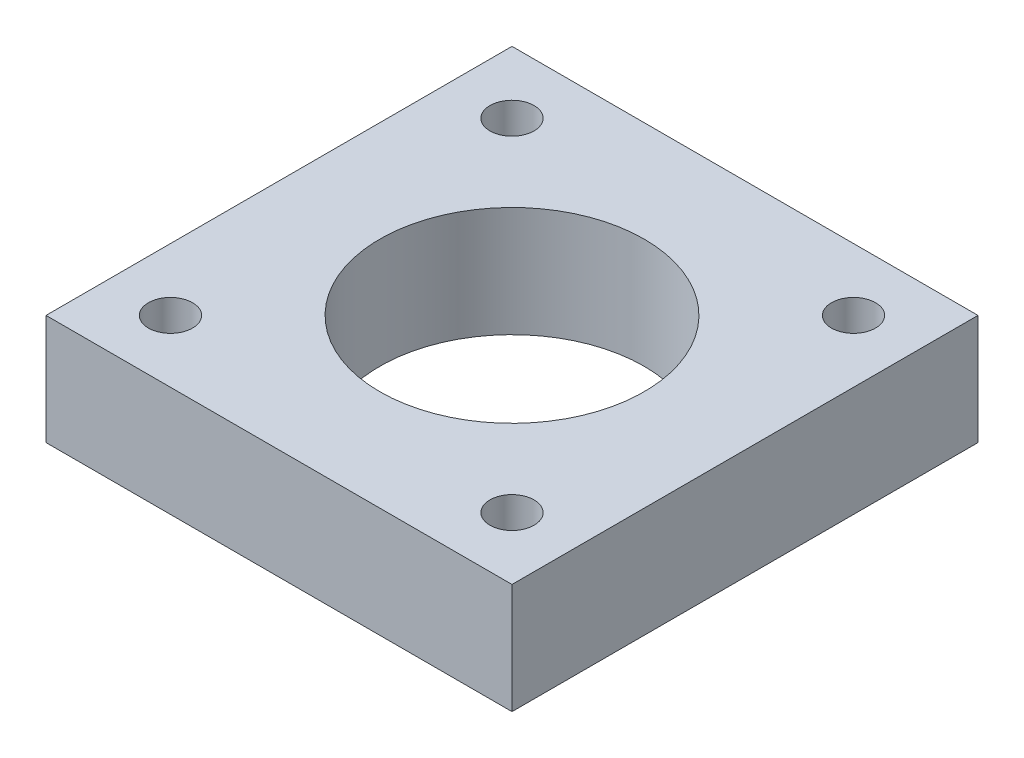
ISO-10303-21;
HEADER;
FILE_DESCRIPTION(('STEP AP214'),'2;1');
FILE_NAME('part.step','',(''),(''),'','','');
FILE_SCHEMA(('AUTOMOTIVE_DESIGN { 1 0 10303 214 1 1 1 1 }'));
ENDSEC;
DATA;
#1=APPLICATION_CONTEXT('core data for automotive mechanical design processes');
#2=APPLICATION_PROTOCOL_DEFINITION('international standard','automotive_design',2000,#1);
#3=PRODUCT_CONTEXT('',#1,'mechanical');
#4=PRODUCT('Part','Part','',(#3));
#5=PRODUCT_RELATED_PRODUCT_CATEGORY('part','',(#4));
#6=PRODUCT_DEFINITION_FORMATION('','',#4);
#7=PRODUCT_DEFINITION_CONTEXT('part definition',#1,'design');
#8=PRODUCT_DEFINITION('design','',#6,#7);
#9=PRODUCT_DEFINITION_SHAPE('','',#8);
#10=(LENGTH_UNIT() NAMED_UNIT(*) SI_UNIT(.MILLI.,.METRE.));
#11=(NAMED_UNIT(*) PLANE_ANGLE_UNIT() SI_UNIT($,.RADIAN.));
#12=(NAMED_UNIT(*) SI_UNIT($,.STERADIAN.) SOLID_ANGLE_UNIT());
#13=UNCERTAINTY_MEASURE_WITH_UNIT(LENGTH_MEASURE(1.E-05),#10,'distance_accuracy_value','');
#14=(GEOMETRIC_REPRESENTATION_CONTEXT(3) GLOBAL_UNCERTAINTY_ASSIGNED_CONTEXT((#13)) GLOBAL_UNIT_ASSIGNED_CONTEXT((#10,
#11,#12)) REPRESENTATION_CONTEXT('',''));
#15=CARTESIAN_POINT('',(0.,0.,0.));
#16=DIRECTION('',(0.,0.,1.));
#17=DIRECTION('',(1.,0.,0.));
#18=AXIS2_PLACEMENT_3D('',#15,#16,#17);
#19=CARTESIAN_POINT('',(0.,10.,0.));
#20=DIRECTION('',(0.,1.,0.));
#21=DIRECTION('',(0.,0.,1.));
#22=AXIS2_PLACEMENT_3D('',#19,#20,#21);
#23=PLANE('',#22);
#24=CARTESIAN_POINT('',(-15.5,10.,15.5));
#25=DIRECTION('',(0.,1.,0.));
#26=DIRECTION('',(0.,0.,1.));
#27=AXIS2_PLACEMENT_3D('',#24,#25,#26);
#28=CIRCLE('',#27,2.);
#29=CARTESIAN_POINT('',(-15.5,10.,17.5));
#30=VERTEX_POINT('',#29);
#31=EDGE_CURVE('E127',#30,#30,#28,.T.);
#32=ORIENTED_EDGE('',*,*,#31,.F.);
#33=EDGE_LOOP('',(#32));
#34=FACE_BOUND('',#33,.T.);
#35=CARTESIAN_POINT('',(15.5,10.,15.5));
#36=DIRECTION('',(0.,1.,0.));
#37=DIRECTION('',(0.,0.,1.));
#38=AXIS2_PLACEMENT_3D('',#35,#36,#37);
#39=CIRCLE('',#38,2.00000000000001);
#40=CARTESIAN_POINT('',(15.5,10.,17.5));
#41=VERTEX_POINT('',#40);
#42=EDGE_CURVE('E115',#41,#41,#39,.T.);
#43=ORIENTED_EDGE('',*,*,#42,.F.);
#44=EDGE_LOOP('',(#43));
#45=FACE_BOUND('',#44,.T.);
#46=DIRECTION('',(0.,0.,-1.));
#47=VECTOR('',#46,1.);
#48=CARTESIAN_POINT('',(21.15,10.,-21.15));
#49=LINE('',#48,#47);
#50=CARTESIAN_POINT('',(21.15,10.,21.15));
#51=VERTEX_POINT('',#50);
#52=CARTESIAN_POINT('',(21.15,10.,-21.15));
#53=VERTEX_POINT('',#52);
#54=EDGE_CURVE('E85',#51,#53,#49,.T.);
#55=ORIENTED_EDGE('',*,*,#54,.T.);
#56=DIRECTION('',(-1.,0.,0.));
#57=VECTOR('',#56,1.);
#58=CARTESIAN_POINT('',(-21.15,10.,-21.15));
#59=LINE('',#58,#57);
#60=CARTESIAN_POINT('',(-21.15,10.,-21.15));
#61=VERTEX_POINT('',#60);
#62=EDGE_CURVE('E80',#53,#61,#59,.T.);
#63=ORIENTED_EDGE('',*,*,#62,.T.);
#64=DIRECTION('',(0.,0.,1.));
#65=VECTOR('',#64,1.);
#66=CARTESIAN_POINT('',(-21.15,10.,-21.15));
#67=LINE('',#66,#65);
#68=CARTESIAN_POINT('',(-21.15,10.,21.15));
#69=VERTEX_POINT('',#68);
#70=EDGE_CURVE('E83',#61,#69,#67,.T.);
#71=ORIENTED_EDGE('',*,*,#70,.T.);
#72=DIRECTION('',(1.,0.,0.));
#73=VECTOR('',#72,1.);
#74=CARTESIAN_POINT('',(-21.15,10.,21.15));
#75=LINE('',#74,#73);
#76=EDGE_CURVE('E50',#69,#51,#75,.T.);
#77=ORIENTED_EDGE('',*,*,#76,.T.);
#78=EDGE_LOOP('',(#55,#63,#71,#77));
#79=FACE_BOUND('',#78,.T.);
#80=CARTESIAN_POINT('',(15.5,10.,-15.5));
#81=DIRECTION('',(0.,1.,0.));
#82=DIRECTION('',(0.,0.,1.));
#83=AXIS2_PLACEMENT_3D('',#80,#81,#82);
#84=CIRCLE('',#83,2.);
#85=CARTESIAN_POINT('',(15.5,10.,-13.5));
#86=VERTEX_POINT('',#85);
#87=EDGE_CURVE('E100',#86,#86,#84,.T.);
#88=ORIENTED_EDGE('',*,*,#87,.F.);
#89=EDGE_LOOP('',(#88));
#90=FACE_BOUND('',#89,.T.);
#91=CARTESIAN_POINT('',(-15.5,10.,-15.5));
#92=DIRECTION('',(0.,1.,0.));
#93=DIRECTION('',(0.,0.,1.));
#94=AXIS2_PLACEMENT_3D('',#91,#92,#93);
#95=CIRCLE('',#94,2.);
#96=CARTESIAN_POINT('',(-15.5,10.,-13.5));
#97=VERTEX_POINT('',#96);
#98=EDGE_CURVE('E121',#97,#97,#95,.T.);
#99=ORIENTED_EDGE('',*,*,#98,.F.);
#100=EDGE_LOOP('',(#99));
#101=FACE_BOUND('',#100,.T.);
#102=CARTESIAN_POINT('',(0.,10.,0.));
#103=DIRECTION('',(0.,1.,0.));
#104=DIRECTION('',(0.,0.,1.));
#105=AXIS2_PLACEMENT_3D('',#102,#103,#104);
#106=CIRCLE('',#105,12.);
#107=CARTESIAN_POINT('',(0.,10.,12.));
#108=VERTEX_POINT('',#107);
#109=EDGE_CURVE('E133',#108,#108,#106,.T.);
#110=ORIENTED_EDGE('',*,*,#109,.F.);
#111=EDGE_LOOP('',(#110));
#112=FACE_BOUND('',#111,.T.);
#113=ADVANCED_FACE('F33',(#34,#45,#79,#90,#101,#112),#23,.T.);
#114=CARTESIAN_POINT('',(0.,0.,0.));
#115=DIRECTION('',(0.,1.,0.));
#116=DIRECTION('',(0.,0.,1.));
#117=AXIS2_PLACEMENT_3D('',#114,#115,#116);
#118=PLANE('',#117);
#119=DIRECTION('',(0.,0.,-1.));
#120=VECTOR('',#119,1.);
#121=CARTESIAN_POINT('',(21.15,0.,-21.15));
#122=LINE('',#121,#120);
#123=CARTESIAN_POINT('',(21.15,0.,21.15));
#124=VERTEX_POINT('',#123);
#125=CARTESIAN_POINT('',(21.15,0.,-21.15));
#126=VERTEX_POINT('',#125);
#127=EDGE_CURVE('E97',#124,#126,#122,.T.);
#128=ORIENTED_EDGE('',*,*,#127,.F.);
#129=DIRECTION('',(1.,0.,0.));
#130=VECTOR('',#129,1.);
#131=CARTESIAN_POINT('',(-21.15,0.,21.15));
#132=LINE('',#131,#130);
#133=CARTESIAN_POINT('',(-21.15,0.,21.15));
#134=VERTEX_POINT('',#133);
#135=EDGE_CURVE('E73',#134,#124,#132,.T.);
#136=ORIENTED_EDGE('',*,*,#135,.F.);
#137=DIRECTION('',(0.,0.,1.));
#138=VECTOR('',#137,1.);
#139=CARTESIAN_POINT('',(-21.15,0.,-21.15));
#140=LINE('',#139,#138);
#141=CARTESIAN_POINT('',(-21.15,0.,-21.15));
#142=VERTEX_POINT('',#141);
#143=EDGE_CURVE('E67',#142,#134,#140,.T.);
#144=ORIENTED_EDGE('',*,*,#143,.F.);
#145=DIRECTION('',(-1.,0.,0.));
#146=VECTOR('',#145,1.);
#147=CARTESIAN_POINT('',(-21.15,0.,-21.15));
#148=LINE('',#147,#146);
#149=EDGE_CURVE('E89',#126,#142,#148,.T.);
#150=ORIENTED_EDGE('',*,*,#149,.F.);
#151=EDGE_LOOP('',(#128,#136,#144,#150));
#152=FACE_BOUND('',#151,.T.);
#153=CARTESIAN_POINT('',(15.5,0.,-15.5));
#154=DIRECTION('',(0.,1.,0.));
#155=DIRECTION('',(0.,0.,1.));
#156=AXIS2_PLACEMENT_3D('',#153,#154,#155);
#157=CIRCLE('',#156,2.);
#158=CARTESIAN_POINT('',(15.5,0.,-13.5));
#159=VERTEX_POINT('',#158);
#160=EDGE_CURVE('E112',#159,#159,#157,.T.);
#161=ORIENTED_EDGE('',*,*,#160,.T.);
#162=EDGE_LOOP('',(#161));
#163=FACE_BOUND('',#162,.T.);
#164=CARTESIAN_POINT('',(15.5,0.,15.5));
#165=DIRECTION('',(0.,1.,0.));
#166=DIRECTION('',(0.,0.,1.));
#167=AXIS2_PLACEMENT_3D('',#164,#165,#166);
#168=CIRCLE('',#167,2.00000000000001);
#169=CARTESIAN_POINT('',(15.5,0.,17.5));
#170=VERTEX_POINT('',#169);
#171=EDGE_CURVE('E118',#170,#170,#168,.T.);
#172=ORIENTED_EDGE('',*,*,#171,.T.);
#173=EDGE_LOOP('',(#172));
#174=FACE_BOUND('',#173,.T.);
#175=CARTESIAN_POINT('',(-15.5,0.,-15.5));
#176=DIRECTION('',(0.,1.,0.));
#177=DIRECTION('',(0.,0.,1.));
#178=AXIS2_PLACEMENT_3D('',#175,#176,#177);
#179=CIRCLE('',#178,2.);
#180=CARTESIAN_POINT('',(-15.5,0.,-13.5));
#181=VERTEX_POINT('',#180);
#182=EDGE_CURVE('E124',#181,#181,#179,.T.);
#183=ORIENTED_EDGE('',*,*,#182,.T.);
#184=EDGE_LOOP('',(#183));
#185=FACE_BOUND('',#184,.T.);
#186=CARTESIAN_POINT('',(-15.5,0.,15.5));
#187=DIRECTION('',(0.,1.,0.));
#188=DIRECTION('',(0.,0.,1.));
#189=AXIS2_PLACEMENT_3D('',#186,#187,#188);
#190=CIRCLE('',#189,2.);
#191=CARTESIAN_POINT('',(-15.5,0.,17.5));
#192=VERTEX_POINT('',#191);
#193=EDGE_CURVE('E130',#192,#192,#190,.T.);
#194=ORIENTED_EDGE('',*,*,#193,.T.);
#195=EDGE_LOOP('',(#194));
#196=FACE_BOUND('',#195,.T.);
#197=CARTESIAN_POINT('',(0.,0.,0.));
#198=DIRECTION('',(0.,1.,0.));
#199=DIRECTION('',(0.,0.,1.));
#200=AXIS2_PLACEMENT_3D('',#197,#198,#199);
#201=CIRCLE('',#200,12.);
#202=CARTESIAN_POINT('',(0.,0.,12.));
#203=VERTEX_POINT('',#202);
#204=EDGE_CURVE('E136',#203,#203,#201,.T.);
#205=ORIENTED_EDGE('',*,*,#204,.T.);
#206=EDGE_LOOP('',(#205));
#207=FACE_BOUND('',#206,.T.);
#208=ADVANCED_FACE('F108',(#152,#163,#174,#185,#196,#207),#118,.F.);
#209=CARTESIAN_POINT('',(21.15,10.,-21.15));
#210=DIRECTION('',(-1.,0.,0.));
#211=DIRECTION('',(0.,0.,1.));
#212=AXIS2_PLACEMENT_3D('',#209,#210,#211);
#213=PLANE('',#212);
#214=ORIENTED_EDGE('',*,*,#127,.T.);
#215=DIRECTION('',(0.,-1.,0.));
#216=VECTOR('',#215,1.);
#217=CARTESIAN_POINT('',(21.15,10.,-21.15));
#218=LINE('',#217,#216);
#219=EDGE_CURVE('E11',#53,#126,#218,.T.);
#220=ORIENTED_EDGE('',*,*,#219,.F.);
#221=ORIENTED_EDGE('',*,*,#54,.F.);
#222=DIRECTION('',(0.,-1.,0.));
#223=VECTOR('',#222,1.);
#224=CARTESIAN_POINT('',(21.15,10.,21.15));
#225=LINE('',#224,#223);
#226=EDGE_CURVE('E93',#51,#124,#225,.T.);
#227=ORIENTED_EDGE('',*,*,#226,.T.);
#228=EDGE_LOOP('',(#214,#220,#221,#227));
#229=FACE_BOUND('',#228,.T.);
#230=ADVANCED_FACE('F35',(#229),#213,.F.);
#231=CARTESIAN_POINT('',(-21.15,10.,-21.15));
#232=DIRECTION('',(0.,0.,1.));
#233=DIRECTION('',(1.,0.,0.));
#234=AXIS2_PLACEMENT_3D('',#231,#232,#233);
#235=PLANE('',#234);
#236=ORIENTED_EDGE('',*,*,#149,.T.);
#237=DIRECTION('',(0.,-1.,0.));
#238=VECTOR('',#237,1.);
#239=CARTESIAN_POINT('',(-21.15,10.,-21.15));
#240=LINE('',#239,#238);
#241=EDGE_CURVE('E42',#61,#142,#240,.T.);
#242=ORIENTED_EDGE('',*,*,#241,.F.);
#243=ORIENTED_EDGE('',*,*,#62,.F.);
#244=ORIENTED_EDGE('',*,*,#219,.T.);
#245=EDGE_LOOP('',(#236,#242,#243,#244));
#246=FACE_BOUND('',#245,.T.);
#247=ADVANCED_FACE('F88',(#246),#235,.F.);
#248=CARTESIAN_POINT('',(-21.15,10.,-21.15));
#249=DIRECTION('',(1.,0.,0.));
#250=DIRECTION('',(0.,0.,-1.));
#251=AXIS2_PLACEMENT_3D('',#248,#249,#250);
#252=PLANE('',#251);
#253=ORIENTED_EDGE('',*,*,#143,.T.);
#254=DIRECTION('',(0.,-1.,0.));
#255=VECTOR('',#254,1.);
#256=CARTESIAN_POINT('',(-21.15,10.,21.15));
#257=LINE('',#256,#255);
#258=EDGE_CURVE('E90',#69,#134,#257,.T.);
#259=ORIENTED_EDGE('',*,*,#258,.F.);
#260=ORIENTED_EDGE('',*,*,#70,.F.);
#261=ORIENTED_EDGE('',*,*,#241,.T.);
#262=EDGE_LOOP('',(#253,#259,#260,#261));
#263=FACE_BOUND('',#262,.T.);
#264=ADVANCED_FACE('F91',(#263),#252,.F.);
#265=CARTESIAN_POINT('',(-21.15,10.,21.15));
#266=DIRECTION('',(0.,0.,-1.));
#267=DIRECTION('',(-1.,0.,0.));
#268=AXIS2_PLACEMENT_3D('',#265,#266,#267);
#269=PLANE('',#268);
#270=ORIENTED_EDGE('',*,*,#135,.T.);
#271=ORIENTED_EDGE('',*,*,#226,.F.);
#272=ORIENTED_EDGE('',*,*,#76,.F.);
#273=ORIENTED_EDGE('',*,*,#258,.T.);
#274=EDGE_LOOP('',(#270,#271,#272,#273));
#275=FACE_BOUND('',#274,.T.);
#276=ADVANCED_FACE('F105',(#275),#269,.F.);
#277=CARTESIAN_POINT('',(15.5,10.,-15.5));
#278=DIRECTION('',(0.,-1.,0.));
#279=DIRECTION('',(0.,0.,-1.));
#280=AXIS2_PLACEMENT_3D('',#277,#278,#279);
#281=CYLINDRICAL_SURFACE('',#280,2.);
#282=ORIENTED_EDGE('',*,*,#87,.T.);
#283=EDGE_LOOP('',(#282));
#284=FACE_BOUND('',#283,.T.);
#285=ORIENTED_EDGE('',*,*,#160,.F.);
#286=EDGE_LOOP('',(#285));
#287=FACE_BOUND('',#286,.T.);
#288=ADVANCED_FACE('F155',(#284,#287),#281,.F.);
#289=CARTESIAN_POINT('',(15.5,10.,15.5));
#290=DIRECTION('',(0.,-1.,0.));
#291=DIRECTION('',(0.,0.,-1.));
#292=AXIS2_PLACEMENT_3D('',#289,#290,#291);
#293=CYLINDRICAL_SURFACE('',#292,2.00000000000001);
#294=ORIENTED_EDGE('',*,*,#42,.T.);
#295=EDGE_LOOP('',(#294));
#296=FACE_BOUND('',#295,.T.);
#297=ORIENTED_EDGE('',*,*,#171,.F.);
#298=EDGE_LOOP('',(#297));
#299=FACE_BOUND('',#298,.T.);
#300=ADVANCED_FACE('F201',(#296,#299),#293,.F.);
#301=CARTESIAN_POINT('',(-15.5,10.,-15.5));
#302=DIRECTION('',(0.,-1.,0.));
#303=DIRECTION('',(0.,0.,-1.));
#304=AXIS2_PLACEMENT_3D('',#301,#302,#303);
#305=CYLINDRICAL_SURFACE('',#304,2.);
#306=ORIENTED_EDGE('',*,*,#98,.T.);
#307=EDGE_LOOP('',(#306));
#308=FACE_BOUND('',#307,.T.);
#309=ORIENTED_EDGE('',*,*,#182,.F.);
#310=EDGE_LOOP('',(#309));
#311=FACE_BOUND('',#310,.T.);
#312=ADVANCED_FACE('F209',(#308,#311),#305,.F.);
#313=CARTESIAN_POINT('',(-15.5,10.,15.5));
#314=DIRECTION('',(0.,-1.,0.));
#315=DIRECTION('',(0.,0.,-1.));
#316=AXIS2_PLACEMENT_3D('',#313,#314,#315);
#317=CYLINDRICAL_SURFACE('',#316,2.);
#318=ORIENTED_EDGE('',*,*,#31,.T.);
#319=EDGE_LOOP('',(#318));
#320=FACE_BOUND('',#319,.T.);
#321=ORIENTED_EDGE('',*,*,#193,.F.);
#322=EDGE_LOOP('',(#321));
#323=FACE_BOUND('',#322,.T.);
#324=ADVANCED_FACE('F217',(#320,#323),#317,.F.);
#325=CARTESIAN_POINT('',(0.,10.,0.));
#326=DIRECTION('',(0.,-1.,0.));
#327=DIRECTION('',(0.,0.,-1.));
#328=AXIS2_PLACEMENT_3D('',#325,#326,#327);
#329=CYLINDRICAL_SURFACE('',#328,12.);
#330=ORIENTED_EDGE('',*,*,#109,.T.);
#331=EDGE_LOOP('',(#330));
#332=FACE_BOUND('',#331,.T.);
#333=ORIENTED_EDGE('',*,*,#204,.F.);
#334=EDGE_LOOP('',(#333));
#335=FACE_BOUND('',#334,.T.);
#336=ADVANCED_FACE('F142',(#332,#335),#329,.F.);
#337=CLOSED_SHELL('',(#113,#208,#230,#247,#264,#276,#288,#300,#312,#324,#336));
#338=MANIFOLD_SOLID_BREP('B2',#337);
#339=ADVANCED_BREP_SHAPE_REPRESENTATION('',(#18,#338),#14);
#340=SHAPE_DEFINITION_REPRESENTATION(#9,#339);
ENDSEC;
END-ISO-10303-21;
